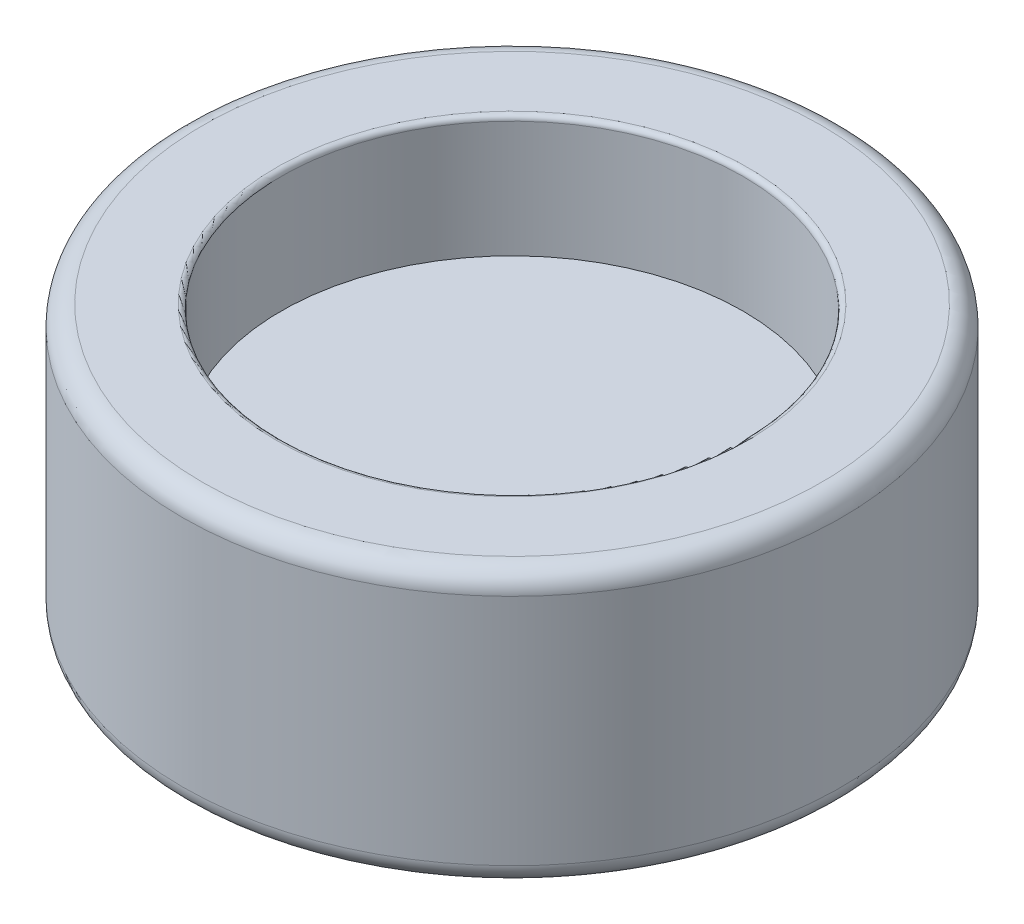
ISO-10303-21;
HEADER;
FILE_DESCRIPTION(('STEP AP214'),'2;1');
FILE_NAME('part.step','',(''),(''),'','','');
FILE_SCHEMA(('AUTOMOTIVE_DESIGN { 1 0 10303 214 1 1 1 1 }'));
ENDSEC;
DATA;
#1=APPLICATION_CONTEXT('core data for automotive mechanical design processes');
#2=APPLICATION_PROTOCOL_DEFINITION('international standard','automotive_design',2000,#1);
#3=PRODUCT_CONTEXT('',#1,'mechanical');
#4=PRODUCT('Part','Part','',(#3));
#5=PRODUCT_RELATED_PRODUCT_CATEGORY('part','',(#4));
#6=PRODUCT_DEFINITION_FORMATION('','',#4);
#7=PRODUCT_DEFINITION_CONTEXT('part definition',#1,'design');
#8=PRODUCT_DEFINITION('design','',#6,#7);
#9=PRODUCT_DEFINITION_SHAPE('','',#8);
#10=(LENGTH_UNIT() NAMED_UNIT(*) SI_UNIT(.MILLI.,.METRE.));
#11=(NAMED_UNIT(*) PLANE_ANGLE_UNIT() SI_UNIT($,.RADIAN.));
#12=(NAMED_UNIT(*) SI_UNIT($,.STERADIAN.) SOLID_ANGLE_UNIT());
#13=UNCERTAINTY_MEASURE_WITH_UNIT(LENGTH_MEASURE(1.E-05),#10,'distance_accuracy_value','');
#14=(GEOMETRIC_REPRESENTATION_CONTEXT(3) GLOBAL_UNCERTAINTY_ASSIGNED_CONTEXT((#13)) GLOBAL_UNIT_ASSIGNED_CONTEXT((#10,
#11,#12)) REPRESENTATION_CONTEXT('',''));
#15=CARTESIAN_POINT('',(0.,0.,0.));
#16=DIRECTION('',(0.,0.,1.));
#17=DIRECTION('',(1.,0.,0.));
#18=AXIS2_PLACEMENT_3D('',#15,#16,#17);
#19=CARTESIAN_POINT('',(0.,27.,0.));
#20=DIRECTION('',(0.,1.,0.));
#21=DIRECTION('',(0.,0.,1.));
#22=AXIS2_PLACEMENT_3D('',#19,#20,#21);
#23=PLANE('',#22);
#24=CARTESIAN_POINT('',(0.,27.,0.));
#25=DIRECTION('',(0.,1.,0.));
#26=DIRECTION('',(0.,0.,1.));
#27=AXIS2_PLACEMENT_3D('',#24,#25,#26);
#28=CIRCLE('',#27,23.2790134970468);
#29=CARTESIAN_POINT('',(0.,27.,23.2790134970468));
#30=VERTEX_POINT('',#29);
#31=EDGE_CURVE('E43',#30,#30,#28,.F.);
#32=ORIENTED_EDGE('',*,*,#31,.T.);
#33=EDGE_LOOP('',(#32));
#34=FACE_BOUND('',#33,.T.);
#35=CARTESIAN_POINT('',(0.,27.,0.));
#36=DIRECTION('',(0.,1.,0.));
#37=DIRECTION('',(0.,0.,1.));
#38=AXIS2_PLACEMENT_3D('',#35,#36,#37);
#39=CIRCLE('',#38,30.5);
#40=CARTESIAN_POINT('',(0.,27.,30.5));
#41=VERTEX_POINT('',#40);
#42=EDGE_CURVE('E64',#41,#41,#39,.T.);
#43=ORIENTED_EDGE('',*,*,#42,.T.);
#44=EDGE_LOOP('',(#43));
#45=FACE_BOUND('',#44,.T.);
#46=ADVANCED_FACE('F32',(#34,#45),#23,.T.);
#47=CARTESIAN_POINT('',(0.,0.,0.));
#48=DIRECTION('',(0.,1.,0.));
#49=DIRECTION('',(0.,0.,1.));
#50=AXIS2_PLACEMENT_3D('',#47,#48,#49);
#51=PLANE('',#50);
#52=CARTESIAN_POINT('',(0.,0.,0.));
#53=DIRECTION('',(0.,1.,0.));
#54=DIRECTION('',(0.,0.,1.));
#55=AXIS2_PLACEMENT_3D('',#52,#53,#54);
#56=CIRCLE('',#55,23.2790134970468);
#57=CARTESIAN_POINT('',(0.,0.,23.2790134970468));
#58=VERTEX_POINT('',#57);
#59=EDGE_CURVE('E39',#58,#58,#56,.T.);
#60=ORIENTED_EDGE('',*,*,#59,.T.);
#61=EDGE_LOOP('',(#60));
#62=FACE_BOUND('',#61,.T.);
#63=CARTESIAN_POINT('',(0.,0.,0.));
#64=DIRECTION('',(0.,1.,0.));
#65=DIRECTION('',(0.,0.,1.));
#66=AXIS2_PLACEMENT_3D('',#63,#64,#65);
#67=CIRCLE('',#66,30.5);
#68=CARTESIAN_POINT('',(0.,0.,30.5));
#69=VERTEX_POINT('',#68);
#70=EDGE_CURVE('E55',#69,#69,#67,.F.);
#71=ORIENTED_EDGE('',*,*,#70,.T.);
#72=EDGE_LOOP('',(#71));
#73=FACE_BOUND('',#72,.T.);
#74=ADVANCED_FACE('F87',(#62,#73),#51,.F.);
#75=CARTESIAN_POINT('',(0.,27.,0.));
#76=DIRECTION('',(0.,-1.,0.));
#77=DIRECTION('',(0.,0.,-1.));
#78=AXIS2_PLACEMENT_3D('',#75,#76,#77);
#79=CYLINDRICAL_SURFACE('',#78,32.5);
#80=CARTESIAN_POINT('',(0.,25.,0.));
#81=DIRECTION('',(0.,1.,0.));
#82=DIRECTION('',(0.,0.,1.));
#83=AXIS2_PLACEMENT_3D('',#80,#81,#82);
#84=CIRCLE('',#83,32.5);
#85=CARTESIAN_POINT('',(0.,25.,32.5));
#86=VERTEX_POINT('',#85);
#87=EDGE_CURVE('E58',#86,#86,#84,.F.);
#88=ORIENTED_EDGE('',*,*,#87,.T.);
#89=EDGE_LOOP('',(#88));
#90=FACE_BOUND('',#89,.T.);
#91=CARTESIAN_POINT('',(0.,2.,0.));
#92=DIRECTION('',(0.,1.,0.));
#93=DIRECTION('',(0.,0.,1.));
#94=AXIS2_PLACEMENT_3D('',#91,#92,#93);
#95=CIRCLE('',#94,32.5);
#96=CARTESIAN_POINT('',(0.,2.,32.5));
#97=VERTEX_POINT('',#96);
#98=EDGE_CURVE('E61',#97,#97,#95,.T.);
#99=ORIENTED_EDGE('',*,*,#98,.T.);
#100=EDGE_LOOP('',(#99));
#101=FACE_BOUND('',#100,.T.);
#102=ADVANCED_FACE('F93',(#90,#101),#79,.T.);
#103=CARTESIAN_POINT('',(0.,27.,0.));
#104=DIRECTION('',(0.,-1.,0.));
#105=DIRECTION('',(0.,0.,-1.));
#106=AXIS2_PLACEMENT_3D('',#103,#104,#105);
#107=CYLINDRICAL_SURFACE('',#106,22.7790134970468);
#108=CARTESIAN_POINT('',(0.,15.,0.));
#109=DIRECTION('',(0.,1.,0.));
#110=DIRECTION('',(0.,0.,1.));
#111=AXIS2_PLACEMENT_3D('',#108,#109,#110);
#112=CIRCLE('',#111,22.7790134970468);
#113=CARTESIAN_POINT('',(0.,15.,22.7790134970468));
#114=VERTEX_POINT('',#113);
#115=EDGE_CURVE('E10',#114,#114,#112,.T.);
#116=ORIENTED_EDGE('',*,*,#115,.F.);
#117=EDGE_LOOP('',(#116));
#118=FACE_BOUND('',#117,.T.);
#119=CARTESIAN_POINT('',(0.,26.5,0.));
#120=DIRECTION('',(0.,1.,0.));
#121=DIRECTION('',(0.,0.,1.));
#122=AXIS2_PLACEMENT_3D('',#119,#120,#121);
#123=CIRCLE('',#122,22.7790134970468);
#124=CARTESIAN_POINT('',(0.,26.5,22.7790134970468));
#125=VERTEX_POINT('',#124);
#126=EDGE_CURVE('E47',#125,#125,#123,.T.);
#127=ORIENTED_EDGE('',*,*,#126,.T.);
#128=EDGE_LOOP('',(#127));
#129=FACE_BOUND('',#128,.T.);
#130=ADVANCED_FACE('F97',(#118,#129),#107,.F.);
#131=CARTESIAN_POINT('',(0.,25.,0.));
#132=DIRECTION('',(0.,1.,0.));
#133=DIRECTION('',(0.,0.,1.));
#134=AXIS2_PLACEMENT_3D('',#131,#132,#133);
#135=TOROIDAL_SURFACE('',#134,30.5,2.);
#136=ORIENTED_EDGE('',*,*,#87,.F.);
#137=EDGE_LOOP('',(#136));
#138=FACE_BOUND('',#137,.T.);
#139=ORIENTED_EDGE('',*,*,#42,.F.);
#140=EDGE_LOOP('',(#139));
#141=FACE_BOUND('',#140,.T.);
#142=ADVANCED_FACE('F102',(#138,#141),#135,.T.);
#143=CARTESIAN_POINT('',(0.,2.,0.));
#144=DIRECTION('',(0.,1.,0.));
#145=DIRECTION('',(0.,0.,1.));
#146=AXIS2_PLACEMENT_3D('',#143,#144,#145);
#147=TOROIDAL_SURFACE('',#146,30.5,2.);
#148=ORIENTED_EDGE('',*,*,#70,.F.);
#149=EDGE_LOOP('',(#148));
#150=FACE_BOUND('',#149,.T.);
#151=ORIENTED_EDGE('',*,*,#98,.F.);
#152=EDGE_LOOP('',(#151));
#153=FACE_BOUND('',#152,.T.);
#154=ADVANCED_FACE('F105',(#150,#153),#147,.T.);
#155=CARTESIAN_POINT('',(0.,26.5,0.));
#156=DIRECTION('',(0.,1.,0.));
#157=DIRECTION('',(0.,0.,1.));
#158=AXIS2_PLACEMENT_3D('',#155,#156,#157);
#159=TOROIDAL_SURFACE('',#158,23.2790134970468,0.5);
#160=ORIENTED_EDGE('',*,*,#31,.F.);
#161=EDGE_LOOP('',(#160));
#162=FACE_BOUND('',#161,.T.);
#163=ORIENTED_EDGE('',*,*,#126,.F.);
#164=EDGE_LOOP('',(#163));
#165=FACE_BOUND('',#164,.T.);
#166=ADVANCED_FACE('F83',(#162,#165),#159,.T.);
#167=CARTESIAN_POINT('',(0.,0.5,0.));
#168=DIRECTION('',(0.,1.,0.));
#169=DIRECTION('',(0.,0.,1.));
#170=AXIS2_PLACEMENT_3D('',#167,#168,#169);
#171=TOROIDAL_SURFACE('',#170,23.2790134970468,0.5);
#172=CARTESIAN_POINT('',(0.,0.5,0.));
#173=DIRECTION('',(0.,1.,0.));
#174=DIRECTION('',(0.,0.,1.));
#175=AXIS2_PLACEMENT_3D('',#172,#173,#174);
#176=CIRCLE('',#175,22.7790134970468);
#177=CARTESIAN_POINT('',(0.,0.5,22.7790134970468));
#178=VERTEX_POINT('',#177);
#179=EDGE_CURVE('E52',#178,#178,#176,.F.);
#180=ORIENTED_EDGE('',*,*,#179,.F.);
#181=EDGE_LOOP('',(#180));
#182=FACE_BOUND('',#181,.T.);
#183=ORIENTED_EDGE('',*,*,#59,.F.);
#184=EDGE_LOOP('',(#183));
#185=FACE_BOUND('',#184,.T.);
#186=ADVANCED_FACE('F34',(#182,#185),#171,.T.);
#187=CARTESIAN_POINT('',(0.,0.,0.));
#188=DIRECTION('',(0.,1.,0.));
#189=DIRECTION('',(0.,0.,1.));
#190=AXIS2_PLACEMENT_3D('',#187,#188,#189);
#191=PLANE('',#190);
#192=CARTESIAN_POINT('',(0.,0.,0.));
#193=DIRECTION('',(0.,1.,0.));
#194=DIRECTION('',(0.,0.,1.));
#195=AXIS2_PLACEMENT_3D('',#192,#193,#194);
#196=CIRCLE('',#195,22.7790134970468);
#197=CARTESIAN_POINT('',(0.,0.,22.7790134970468));
#198=VERTEX_POINT('',#197);
#199=EDGE_CURVE('E67',#198,#198,#196,.T.);
#200=ORIENTED_EDGE('',*,*,#199,.F.);
#201=EDGE_LOOP('',(#200));
#202=FACE_BOUND('',#201,.T.);
#203=ADVANCED_FACE('F74',(#202),#191,.F.);
#204=CARTESIAN_POINT('',(0.,15.,0.));
#205=DIRECTION('',(0.,-1.,0.));
#206=DIRECTION('',(0.,0.,-1.));
#207=AXIS2_PLACEMENT_3D('',#204,#205,#206);
#208=CYLINDRICAL_SURFACE('',#207,22.7790134970468);
#209=ORIENTED_EDGE('',*,*,#199,.T.);
#210=EDGE_LOOP('',(#209));
#211=FACE_BOUND('',#210,.T.);
#212=ORIENTED_EDGE('',*,*,#179,.T.);
#213=EDGE_LOOP('',(#212));
#214=FACE_BOUND('',#213,.T.);
#215=ADVANCED_FACE('F71',(#211,#214),#208,.T.);
#216=CARTESIAN_POINT('',(0.,15.,0.));
#217=DIRECTION('',(0.,1.,0.));
#218=DIRECTION('',(0.,0.,1.));
#219=AXIS2_PLACEMENT_3D('',#216,#217,#218);
#220=PLANE('',#219);
#221=ORIENTED_EDGE('',*,*,#115,.T.);
#222=EDGE_LOOP('',(#221));
#223=FACE_BOUND('',#222,.T.);
#224=ADVANCED_FACE('F81',(#223),#220,.T.);
#225=CLOSED_SHELL('',(#46,#74,#102,#130,#142,#154,#166,#186,#203,#215,#224));
#226=MANIFOLD_SOLID_BREP('B2',#225);
#227=ADVANCED_BREP_SHAPE_REPRESENTATION('',(#18,#226),#14);
#228=SHAPE_DEFINITION_REPRESENTATION(#9,#227);
ENDSEC;
END-ISO-10303-21;
